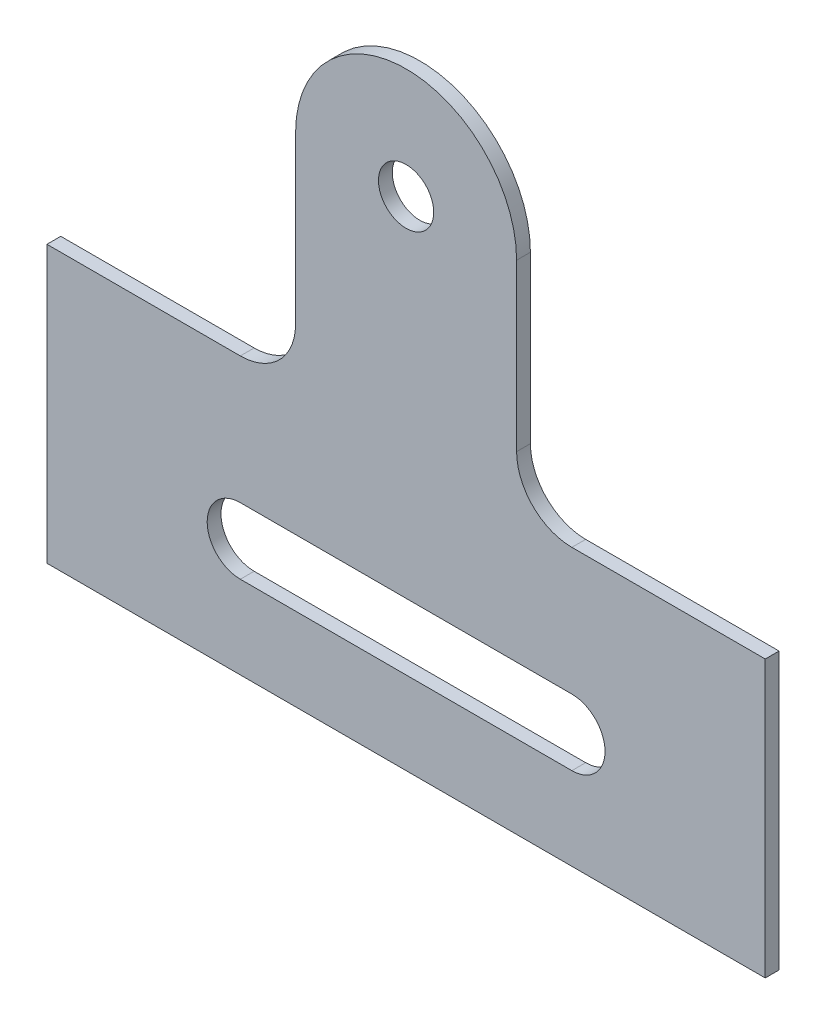
ISO-10303-21;
HEADER;
FILE_DESCRIPTION(('STEP AP214'),'2;1');
FILE_NAME('part.step','',(''),(''),'','','');
FILE_SCHEMA(('AUTOMOTIVE_DESIGN { 1 0 10303 214 1 1 1 1 }'));
ENDSEC;
DATA;
#1=APPLICATION_CONTEXT('core data for automotive mechanical design processes');
#2=APPLICATION_PROTOCOL_DEFINITION('international standard','automotive_design',2000,#1);
#3=PRODUCT_CONTEXT('',#1,'mechanical');
#4=PRODUCT('Part','Part','',(#3));
#5=PRODUCT_RELATED_PRODUCT_CATEGORY('part','',(#4));
#6=PRODUCT_DEFINITION_FORMATION('','',#4);
#7=PRODUCT_DEFINITION_CONTEXT('part definition',#1,'design');
#8=PRODUCT_DEFINITION('design','',#6,#7);
#9=PRODUCT_DEFINITION_SHAPE('','',#8);
#10=(LENGTH_UNIT() NAMED_UNIT(*) SI_UNIT(.MILLI.,.METRE.));
#11=(NAMED_UNIT(*) PLANE_ANGLE_UNIT() SI_UNIT($,.RADIAN.));
#12=(NAMED_UNIT(*) SI_UNIT($,.STERADIAN.) SOLID_ANGLE_UNIT());
#13=UNCERTAINTY_MEASURE_WITH_UNIT(LENGTH_MEASURE(1.E-05),#10,'distance_accuracy_value','');
#14=(GEOMETRIC_REPRESENTATION_CONTEXT(3) GLOBAL_UNCERTAINTY_ASSIGNED_CONTEXT((#13)) GLOBAL_UNIT_ASSIGNED_CONTEXT((#10,
#11,#12)) REPRESENTATION_CONTEXT('',''));
#15=CARTESIAN_POINT('',(0.,0.,0.));
#16=DIRECTION('',(0.,0.,1.));
#17=DIRECTION('',(1.,0.,0.));
#18=AXIS2_PLACEMENT_3D('',#15,#16,#17);
#19=CARTESIAN_POINT('',(0.,90.,2.5));
#20=DIRECTION('',(0.,0.,1.));
#21=DIRECTION('',(1.,0.,0.));
#22=AXIS2_PLACEMENT_3D('',#19,#20,#21);
#23=PLANE('',#22);
#24=DIRECTION('',(1.,0.,0.));
#25=VECTOR('',#24,1.);
#26=CARTESIAN_POINT('',(-30.,15.,2.5));
#27=LINE('',#26,#25);
#28=CARTESIAN_POINT('',(-30.,15.,2.5));
#29=VERTEX_POINT('',#28);
#30=CARTESIAN_POINT('',(30.,15.,2.5));
#31=VERTEX_POINT('',#30);
#32=EDGE_CURVE('E150',#29,#31,#27,.T.);
#33=ORIENTED_EDGE('',*,*,#32,.F.);
#34=CARTESIAN_POINT('',(-30.,21.,2.5));
#35=DIRECTION('',(0.,0.,1.));
#36=DIRECTION('',(1.,0.,0.));
#37=AXIS2_PLACEMENT_3D('',#34,#35,#36);
#38=CIRCLE('',#37,6.);
#39=CARTESIAN_POINT('',(-30.,27.,2.5));
#40=VERTEX_POINT('',#39);
#41=EDGE_CURVE('E141',#40,#29,#38,.T.);
#42=ORIENTED_EDGE('',*,*,#41,.F.);
#43=DIRECTION('',(-1.,0.,0.));
#44=VECTOR('',#43,1.);
#45=CARTESIAN_POINT('',(-30.,27.,2.5));
#46=LINE('',#45,#44);
#47=CARTESIAN_POINT('',(30.,27.,2.5));
#48=VERTEX_POINT('',#47);
#49=EDGE_CURVE('E168',#48,#40,#46,.T.);
#50=ORIENTED_EDGE('',*,*,#49,.F.);
#51=CARTESIAN_POINT('',(30.,21.,2.5));
#52=DIRECTION('',(0.,0.,1.));
#53=DIRECTION('',(1.,0.,0.));
#54=AXIS2_PLACEMENT_3D('',#51,#52,#53);
#55=CIRCLE('',#54,6.);
#56=EDGE_CURVE('E164',#31,#48,#55,.T.);
#57=ORIENTED_EDGE('',*,*,#56,.F.);
#58=EDGE_LOOP('',(#33,#42,#50,#57));
#59=FACE_BOUND('',#58,.T.);
#60=CARTESIAN_POINT('',(0.,90.,2.5));
#61=DIRECTION('',(0.,0.,1.));
#62=DIRECTION('',(1.,0.,0.));
#63=AXIS2_PLACEMENT_3D('',#60,#61,#62);
#64=CIRCLE('',#63,20.);
#65=CARTESIAN_POINT('',(20.,90.,2.5));
#66=VERTEX_POINT('',#65);
#67=CARTESIAN_POINT('',(-20.,90.,2.5));
#68=VERTEX_POINT('',#67);
#69=EDGE_CURVE('E192',#66,#68,#64,.T.);
#70=ORIENTED_EDGE('',*,*,#69,.T.);
#71=DIRECTION('',(0.,-1.,0.));
#72=VECTOR('',#71,1.);
#73=CARTESIAN_POINT('',(-20.,60.,2.5));
#74=LINE('',#73,#72);
#75=CARTESIAN_POINT('',(-20.,60.,2.5));
#76=VERTEX_POINT('',#75);
#77=EDGE_CURVE('E196',#68,#76,#74,.T.);
#78=ORIENTED_EDGE('',*,*,#77,.T.);
#79=CARTESIAN_POINT('',(-30.,60.,2.5));
#80=DIRECTION('',(0.,0.,-1.));
#81=DIRECTION('',(-1.,0.,0.));
#82=AXIS2_PLACEMENT_3D('',#79,#80,#81);
#83=CIRCLE('',#82,9.99999999999999);
#84=CARTESIAN_POINT('',(-30.,50.,2.5));
#85=VERTEX_POINT('',#84);
#86=EDGE_CURVE('E200',#76,#85,#83,.T.);
#87=ORIENTED_EDGE('',*,*,#86,.T.);
#88=DIRECTION('',(-1.,0.,0.));
#89=VECTOR('',#88,1.);
#90=CARTESIAN_POINT('',(-65.,50.,2.5));
#91=LINE('',#90,#89);
#92=CARTESIAN_POINT('',(-65.,50.,2.5));
#93=VERTEX_POINT('',#92);
#94=EDGE_CURVE('E203',#85,#93,#91,.T.);
#95=ORIENTED_EDGE('',*,*,#94,.T.);
#96=DIRECTION('',(0.,-1.,0.));
#97=VECTOR('',#96,1.);
#98=CARTESIAN_POINT('',(-65.,0.,2.5));
#99=LINE('',#98,#97);
#100=CARTESIAN_POINT('',(-65.,0.,2.5));
#101=VERTEX_POINT('',#100);
#102=EDGE_CURVE('E206',#93,#101,#99,.T.);
#103=ORIENTED_EDGE('',*,*,#102,.T.);
#104=DIRECTION('',(1.,0.,0.));
#105=VECTOR('',#104,1.);
#106=CARTESIAN_POINT('',(-65.,0.,2.5));
#107=LINE('',#106,#105);
#108=CARTESIAN_POINT('',(65.,0.,2.5));
#109=VERTEX_POINT('',#108);
#110=EDGE_CURVE('E209',#101,#109,#107,.T.);
#111=ORIENTED_EDGE('',*,*,#110,.T.);
#112=DIRECTION('',(0.,1.,0.));
#113=VECTOR('',#112,1.);
#114=CARTESIAN_POINT('',(65.,0.,2.5));
#115=LINE('',#114,#113);
#116=CARTESIAN_POINT('',(65.,50.,2.5));
#117=VERTEX_POINT('',#116);
#118=EDGE_CURVE('E212',#109,#117,#115,.T.);
#119=ORIENTED_EDGE('',*,*,#118,.T.);
#120=DIRECTION('',(-1.,0.,0.));
#121=VECTOR('',#120,1.);
#122=CARTESIAN_POINT('',(65.,50.,2.5));
#123=LINE('',#122,#121);
#124=CARTESIAN_POINT('',(30.,50.,2.5));
#125=VERTEX_POINT('',#124);
#126=EDGE_CURVE('E215',#117,#125,#123,.T.);
#127=ORIENTED_EDGE('',*,*,#126,.T.);
#128=CARTESIAN_POINT('',(30.,60.,2.5));
#129=DIRECTION('',(0.,0.,-1.));
#130=DIRECTION('',(1.,0.,0.));
#131=AXIS2_PLACEMENT_3D('',#128,#129,#130);
#132=CIRCLE('',#131,9.99999999999999);
#133=CARTESIAN_POINT('',(20.,60.,2.5));
#134=VERTEX_POINT('',#133);
#135=EDGE_CURVE('E218',#125,#134,#132,.T.);
#136=ORIENTED_EDGE('',*,*,#135,.T.);
#137=DIRECTION('',(0.,1.,0.));
#138=VECTOR('',#137,1.);
#139=CARTESIAN_POINT('',(20.,60.,2.5));
#140=LINE('',#139,#138);
#141=EDGE_CURVE('E221',#134,#66,#140,.T.);
#142=ORIENTED_EDGE('',*,*,#141,.T.);
#143=EDGE_LOOP('',(#70,#78,#87,#95,#103,#111,#119,#127,#136,#142));
#144=FACE_BOUND('',#143,.T.);
#145=CARTESIAN_POINT('',(0.,90.,2.5));
#146=DIRECTION('',(0.,0.,1.));
#147=DIRECTION('',(1.,0.,0.));
#148=AXIS2_PLACEMENT_3D('',#145,#146,#147);
#149=CIRCLE('',#148,5.);
#150=CARTESIAN_POINT('',(5.,90.,2.5));
#151=VERTEX_POINT('',#150);
#152=EDGE_CURVE('E176',#151,#151,#149,.T.);
#153=ORIENTED_EDGE('',*,*,#152,.F.);
#154=EDGE_LOOP('',(#153));
#155=FACE_BOUND('',#154,.T.);
#156=ADVANCED_FACE('F39',(#59,#144,#155),#23,.T.);
#157=CARTESIAN_POINT('',(0.,90.,0.));
#158=DIRECTION('',(0.,0.,1.));
#159=DIRECTION('',(1.,0.,0.));
#160=AXIS2_PLACEMENT_3D('',#157,#158,#159);
#161=PLANE('',#160);
#162=CARTESIAN_POINT('',(0.,90.,0.));
#163=DIRECTION('',(0.,0.,1.));
#164=DIRECTION('',(1.,0.,0.));
#165=AXIS2_PLACEMENT_3D('',#162,#163,#164);
#166=CIRCLE('',#165,20.);
#167=CARTESIAN_POINT('',(20.,90.,0.));
#168=VERTEX_POINT('',#167);
#169=CARTESIAN_POINT('',(-20.,90.,0.));
#170=VERTEX_POINT('',#169);
#171=EDGE_CURVE('E159',#168,#170,#166,.T.);
#172=ORIENTED_EDGE('',*,*,#171,.F.);
#173=DIRECTION('',(0.,1.,0.));
#174=VECTOR('',#173,1.);
#175=CARTESIAN_POINT('',(20.,60.,0.));
#176=LINE('',#175,#174);
#177=CARTESIAN_POINT('',(20.,60.,0.));
#178=VERTEX_POINT('',#177);
#179=EDGE_CURVE('E197',#178,#168,#176,.T.);
#180=ORIENTED_EDGE('',*,*,#179,.F.);
#181=CARTESIAN_POINT('',(30.,60.,0.));
#182=DIRECTION('',(0.,0.,-1.));
#183=DIRECTION('',(1.,0.,0.));
#184=AXIS2_PLACEMENT_3D('',#181,#182,#183);
#185=CIRCLE('',#184,9.99999999999999);
#186=CARTESIAN_POINT('',(30.,50.,0.));
#187=VERTEX_POINT('',#186);
#188=EDGE_CURVE('E249',#187,#178,#185,.T.);
#189=ORIENTED_EDGE('',*,*,#188,.F.);
#190=DIRECTION('',(-1.,0.,0.));
#191=VECTOR('',#190,1.);
#192=CARTESIAN_POINT('',(65.,50.,0.));
#193=LINE('',#192,#191);
#194=CARTESIAN_POINT('',(65.,50.,0.));
#195=VERTEX_POINT('',#194);
#196=EDGE_CURVE('E246',#195,#187,#193,.T.);
#197=ORIENTED_EDGE('',*,*,#196,.F.);
#198=DIRECTION('',(0.,1.,0.));
#199=VECTOR('',#198,1.);
#200=CARTESIAN_POINT('',(65.,0.,0.));
#201=LINE('',#200,#199);
#202=CARTESIAN_POINT('',(65.,0.,0.));
#203=VERTEX_POINT('',#202);
#204=EDGE_CURVE('E243',#203,#195,#201,.T.);
#205=ORIENTED_EDGE('',*,*,#204,.F.);
#206=DIRECTION('',(1.,0.,0.));
#207=VECTOR('',#206,1.);
#208=CARTESIAN_POINT('',(-65.,0.,0.));
#209=LINE('',#208,#207);
#210=CARTESIAN_POINT('',(-65.,0.,0.));
#211=VERTEX_POINT('',#210);
#212=EDGE_CURVE('E240',#211,#203,#209,.T.);
#213=ORIENTED_EDGE('',*,*,#212,.F.);
#214=DIRECTION('',(0.,-1.,0.));
#215=VECTOR('',#214,1.);
#216=CARTESIAN_POINT('',(-65.,0.,0.));
#217=LINE('',#216,#215);
#218=CARTESIAN_POINT('',(-65.,50.,0.));
#219=VERTEX_POINT('',#218);
#220=EDGE_CURVE('E237',#219,#211,#217,.T.);
#221=ORIENTED_EDGE('',*,*,#220,.F.);
#222=DIRECTION('',(-1.,0.,0.));
#223=VECTOR('',#222,1.);
#224=CARTESIAN_POINT('',(-65.,50.,0.));
#225=LINE('',#224,#223);
#226=CARTESIAN_POINT('',(-30.,50.,0.));
#227=VERTEX_POINT('',#226);
#228=EDGE_CURVE('E234',#227,#219,#225,.T.);
#229=ORIENTED_EDGE('',*,*,#228,.F.);
#230=CARTESIAN_POINT('',(-30.,60.,0.));
#231=DIRECTION('',(0.,0.,-1.));
#232=DIRECTION('',(-1.,0.,0.));
#233=AXIS2_PLACEMENT_3D('',#230,#231,#232);
#234=CIRCLE('',#233,9.99999999999999);
#235=CARTESIAN_POINT('',(-20.,60.,0.));
#236=VERTEX_POINT('',#235);
#237=EDGE_CURVE('E231',#236,#227,#234,.T.);
#238=ORIENTED_EDGE('',*,*,#237,.F.);
#239=DIRECTION('',(0.,-1.,0.));
#240=VECTOR('',#239,1.);
#241=CARTESIAN_POINT('',(-20.,60.,0.));
#242=LINE('',#241,#240);
#243=EDGE_CURVE('E228',#170,#236,#242,.T.);
#244=ORIENTED_EDGE('',*,*,#243,.F.);
#245=EDGE_LOOP('',(#172,#180,#189,#197,#205,#213,#221,#229,#238,#244));
#246=FACE_BOUND('',#245,.T.);
#247=CARTESIAN_POINT('',(-30.,21.,0.));
#248=DIRECTION('',(0.,0.,1.));
#249=DIRECTION('',(1.,0.,0.));
#250=AXIS2_PLACEMENT_3D('',#247,#248,#249);
#251=CIRCLE('',#250,6.);
#252=CARTESIAN_POINT('',(-30.,27.,0.));
#253=VERTEX_POINT('',#252);
#254=CARTESIAN_POINT('',(-30.,15.,0.));
#255=VERTEX_POINT('',#254);
#256=EDGE_CURVE('E63',#253,#255,#251,.T.);
#257=ORIENTED_EDGE('',*,*,#256,.T.);
#258=DIRECTION('',(1.,0.,0.));
#259=VECTOR('',#258,1.);
#260=CARTESIAN_POINT('',(-30.,15.,0.));
#261=LINE('',#260,#259);
#262=CARTESIAN_POINT('',(30.,15.,0.));
#263=VERTEX_POINT('',#262);
#264=EDGE_CURVE('E157',#255,#263,#261,.T.);
#265=ORIENTED_EDGE('',*,*,#264,.T.);
#266=CARTESIAN_POINT('',(30.,21.,0.));
#267=DIRECTION('',(0.,0.,1.));
#268=DIRECTION('',(1.,0.,0.));
#269=AXIS2_PLACEMENT_3D('',#266,#267,#268);
#270=CIRCLE('',#269,6.);
#271=CARTESIAN_POINT('',(30.,27.,0.));
#272=VERTEX_POINT('',#271);
#273=EDGE_CURVE('E179',#263,#272,#270,.T.);
#274=ORIENTED_EDGE('',*,*,#273,.T.);
#275=DIRECTION('',(-1.,0.,0.));
#276=VECTOR('',#275,1.);
#277=CARTESIAN_POINT('',(-30.,27.,0.));
#278=LINE('',#277,#276);
#279=EDGE_CURVE('E151',#272,#253,#278,.T.);
#280=ORIENTED_EDGE('',*,*,#279,.T.);
#281=EDGE_LOOP('',(#257,#265,#274,#280));
#282=FACE_BOUND('',#281,.T.);
#283=CARTESIAN_POINT('',(0.,90.,0.));
#284=DIRECTION('',(0.,0.,1.));
#285=DIRECTION('',(1.,0.,0.));
#286=AXIS2_PLACEMENT_3D('',#283,#284,#285);
#287=CIRCLE('',#286,5.);
#288=CARTESIAN_POINT('',(5.,90.,0.));
#289=VERTEX_POINT('',#288);
#290=EDGE_CURVE('E481',#289,#289,#287,.T.);
#291=ORIENTED_EDGE('',*,*,#290,.T.);
#292=EDGE_LOOP('',(#291));
#293=FACE_BOUND('',#292,.T.);
#294=ADVANCED_FACE('F296',(#246,#282,#293),#161,.F.);
#295=CARTESIAN_POINT('',(0.,90.,2.5));
#296=DIRECTION('',(0.,0.,-1.));
#297=DIRECTION('',(-1.,0.,0.));
#298=AXIS2_PLACEMENT_3D('',#295,#296,#297);
#299=CYLINDRICAL_SURFACE('',#298,20.);
#300=ORIENTED_EDGE('',*,*,#171,.T.);
#301=DIRECTION('',(0.,0.,-1.));
#302=VECTOR('',#301,1.);
#303=CARTESIAN_POINT('',(-20.,90.,2.5));
#304=LINE('',#303,#302);
#305=EDGE_CURVE('E11',#68,#170,#304,.T.);
#306=ORIENTED_EDGE('',*,*,#305,.F.);
#307=ORIENTED_EDGE('',*,*,#69,.F.);
#308=DIRECTION('',(0.,0.,-1.));
#309=VECTOR('',#308,1.);
#310=CARTESIAN_POINT('',(20.,90.,2.5));
#311=LINE('',#310,#309);
#312=EDGE_CURVE('E224',#66,#168,#311,.T.);
#313=ORIENTED_EDGE('',*,*,#312,.T.);
#314=EDGE_LOOP('',(#300,#306,#307,#313));
#315=FACE_BOUND('',#314,.T.);
#316=ADVANCED_FACE('F41',(#315),#299,.T.);
#317=CARTESIAN_POINT('',(-20.,60.,2.5));
#318=DIRECTION('',(1.,0.,0.));
#319=DIRECTION('',(0.,1.,0.));
#320=AXIS2_PLACEMENT_3D('',#317,#318,#319);
#321=PLANE('',#320);
#322=ORIENTED_EDGE('',*,*,#243,.T.);
#323=DIRECTION('',(0.,0.,-1.));
#324=VECTOR('',#323,1.);
#325=CARTESIAN_POINT('',(-20.,60.,2.5));
#326=LINE('',#325,#324);
#327=EDGE_CURVE('E48',#76,#236,#326,.T.);
#328=ORIENTED_EDGE('',*,*,#327,.F.);
#329=ORIENTED_EDGE('',*,*,#77,.F.);
#330=ORIENTED_EDGE('',*,*,#305,.T.);
#331=EDGE_LOOP('',(#322,#328,#329,#330));
#332=FACE_BOUND('',#331,.T.);
#333=ADVANCED_FACE('F313',(#332),#321,.F.);
#334=CARTESIAN_POINT('',(-30.,60.,2.5));
#335=DIRECTION('',(0.,0.,-1.));
#336=DIRECTION('',(-1.,0.,0.));
#337=AXIS2_PLACEMENT_3D('',#334,#335,#336);
#338=CYLINDRICAL_SURFACE('',#337,9.99999999999999);
#339=ORIENTED_EDGE('',*,*,#237,.T.);
#340=DIRECTION('',(0.,0.,-1.));
#341=VECTOR('',#340,1.);
#342=CARTESIAN_POINT('',(-30.,50.,2.5));
#343=LINE('',#342,#341);
#344=EDGE_CURVE('E281',#85,#227,#343,.T.);
#345=ORIENTED_EDGE('',*,*,#344,.F.);
#346=ORIENTED_EDGE('',*,*,#86,.F.);
#347=ORIENTED_EDGE('',*,*,#327,.T.);
#348=EDGE_LOOP('',(#339,#345,#346,#347));
#349=FACE_BOUND('',#348,.T.);
#350=ADVANCED_FACE('F290',(#349),#338,.F.);
#351=CARTESIAN_POINT('',(-65.,50.,2.5));
#352=DIRECTION('',(0.,-1.,0.));
#353=DIRECTION('',(1.,0.,0.));
#354=AXIS2_PLACEMENT_3D('',#351,#352,#353);
#355=PLANE('',#354);
#356=ORIENTED_EDGE('',*,*,#228,.T.);
#357=DIRECTION('',(0.,0.,-1.));
#358=VECTOR('',#357,1.);
#359=CARTESIAN_POINT('',(-65.,50.,2.5));
#360=LINE('',#359,#358);
#361=EDGE_CURVE('E277',#93,#219,#360,.T.);
#362=ORIENTED_EDGE('',*,*,#361,.F.);
#363=ORIENTED_EDGE('',*,*,#94,.F.);
#364=ORIENTED_EDGE('',*,*,#344,.T.);
#365=EDGE_LOOP('',(#356,#362,#363,#364));
#366=FACE_BOUND('',#365,.T.);
#367=ADVANCED_FACE('F302',(#366),#355,.F.);
#368=CARTESIAN_POINT('',(-65.,0.,2.5));
#369=DIRECTION('',(1.,0.,0.));
#370=DIRECTION('',(0.,0.,-1.));
#371=AXIS2_PLACEMENT_3D('',#368,#369,#370);
#372=PLANE('',#371);
#373=ORIENTED_EDGE('',*,*,#220,.T.);
#374=DIRECTION('',(0.,0.,-1.));
#375=VECTOR('',#374,1.);
#376=CARTESIAN_POINT('',(-65.,0.,2.5));
#377=LINE('',#376,#375);
#378=EDGE_CURVE('E273',#101,#211,#377,.T.);
#379=ORIENTED_EDGE('',*,*,#378,.F.);
#380=ORIENTED_EDGE('',*,*,#102,.F.);
#381=ORIENTED_EDGE('',*,*,#361,.T.);
#382=EDGE_LOOP('',(#373,#379,#380,#381));
#383=FACE_BOUND('',#382,.T.);
#384=ADVANCED_FACE('F306',(#383),#372,.F.);
#385=CARTESIAN_POINT('',(-65.,0.,2.5));
#386=DIRECTION('',(0.,1.,0.));
#387=DIRECTION('',(0.,0.,1.));
#388=AXIS2_PLACEMENT_3D('',#385,#386,#387);
#389=PLANE('',#388);
#390=ORIENTED_EDGE('',*,*,#212,.T.);
#391=DIRECTION('',(0.,0.,-1.));
#392=VECTOR('',#391,1.);
#393=CARTESIAN_POINT('',(65.,0.,2.5));
#394=LINE('',#393,#392);
#395=EDGE_CURVE('E269',#109,#203,#394,.T.);
#396=ORIENTED_EDGE('',*,*,#395,.F.);
#397=ORIENTED_EDGE('',*,*,#110,.F.);
#398=ORIENTED_EDGE('',*,*,#378,.T.);
#399=EDGE_LOOP('',(#390,#396,#397,#398));
#400=FACE_BOUND('',#399,.T.);
#401=ADVANCED_FACE('F336',(#400),#389,.F.);
#402=CARTESIAN_POINT('',(65.,0.,2.5));
#403=DIRECTION('',(-1.,0.,0.));
#404=DIRECTION('',(0.,0.,1.));
#405=AXIS2_PLACEMENT_3D('',#402,#403,#404);
#406=PLANE('',#405);
#407=ORIENTED_EDGE('',*,*,#204,.T.);
#408=DIRECTION('',(0.,0.,-1.));
#409=VECTOR('',#408,1.);
#410=CARTESIAN_POINT('',(65.,50.,2.5));
#411=LINE('',#410,#409);
#412=EDGE_CURVE('E265',#117,#195,#411,.T.);
#413=ORIENTED_EDGE('',*,*,#412,.F.);
#414=ORIENTED_EDGE('',*,*,#118,.F.);
#415=ORIENTED_EDGE('',*,*,#395,.T.);
#416=EDGE_LOOP('',(#407,#413,#414,#415));
#417=FACE_BOUND('',#416,.T.);
#418=ADVANCED_FACE('F333',(#417),#406,.F.);
#419=CARTESIAN_POINT('',(65.,50.,2.5));
#420=DIRECTION('',(0.,-1.,0.));
#421=DIRECTION('',(1.,0.,0.));
#422=AXIS2_PLACEMENT_3D('',#419,#420,#421);
#423=PLANE('',#422);
#424=ORIENTED_EDGE('',*,*,#196,.T.);
#425=DIRECTION('',(0.,0.,-1.));
#426=VECTOR('',#425,1.);
#427=CARTESIAN_POINT('',(30.,50.,2.5));
#428=LINE('',#427,#426);
#429=EDGE_CURVE('E261',#125,#187,#428,.T.);
#430=ORIENTED_EDGE('',*,*,#429,.F.);
#431=ORIENTED_EDGE('',*,*,#126,.F.);
#432=ORIENTED_EDGE('',*,*,#412,.T.);
#433=EDGE_LOOP('',(#424,#430,#431,#432));
#434=FACE_BOUND('',#433,.T.);
#435=ADVANCED_FACE('F329',(#434),#423,.F.);
#436=CARTESIAN_POINT('',(30.,60.,2.5));
#437=DIRECTION('',(0.,0.,-1.));
#438=DIRECTION('',(-1.,0.,0.));
#439=AXIS2_PLACEMENT_3D('',#436,#437,#438);
#440=CYLINDRICAL_SURFACE('',#439,9.99999999999999);
#441=ORIENTED_EDGE('',*,*,#188,.T.);
#442=DIRECTION('',(0.,0.,-1.));
#443=VECTOR('',#442,1.);
#444=CARTESIAN_POINT('',(20.,60.,2.5));
#445=LINE('',#444,#443);
#446=EDGE_CURVE('E257',#134,#178,#445,.T.);
#447=ORIENTED_EDGE('',*,*,#446,.F.);
#448=ORIENTED_EDGE('',*,*,#135,.F.);
#449=ORIENTED_EDGE('',*,*,#429,.T.);
#450=EDGE_LOOP('',(#441,#447,#448,#449));
#451=FACE_BOUND('',#450,.T.);
#452=ADVANCED_FACE('F325',(#451),#440,.F.);
#453=CARTESIAN_POINT('',(20.,60.,2.5));
#454=DIRECTION('',(-1.,0.,0.));
#455=DIRECTION('',(0.,-1.,0.));
#456=AXIS2_PLACEMENT_3D('',#453,#454,#455);
#457=PLANE('',#456);
#458=ORIENTED_EDGE('',*,*,#179,.T.);
#459=ORIENTED_EDGE('',*,*,#312,.F.);
#460=ORIENTED_EDGE('',*,*,#141,.F.);
#461=ORIENTED_EDGE('',*,*,#446,.T.);
#462=EDGE_LOOP('',(#458,#459,#460,#461));
#463=FACE_BOUND('',#462,.T.);
#464=ADVANCED_FACE('F320',(#463),#457,.F.);
#465=CARTESIAN_POINT('',(-30.,21.,2.5));
#466=DIRECTION('',(0.,0.,-1.));
#467=DIRECTION('',(-1.,0.,0.));
#468=AXIS2_PLACEMENT_3D('',#465,#466,#467);
#469=CYLINDRICAL_SURFACE('',#468,6.);
#470=ORIENTED_EDGE('',*,*,#256,.F.);
#471=DIRECTION('',(0.,0.,-1.));
#472=VECTOR('',#471,1.);
#473=CARTESIAN_POINT('',(-30.,27.,2.5));
#474=LINE('',#473,#472);
#475=EDGE_CURVE('E145',#40,#253,#474,.T.);
#476=ORIENTED_EDGE('',*,*,#475,.F.);
#477=ORIENTED_EDGE('',*,*,#41,.T.);
#478=DIRECTION('',(0.,0.,-1.));
#479=VECTOR('',#478,1.);
#480=CARTESIAN_POINT('',(-30.,15.,2.5));
#481=LINE('',#480,#479);
#482=EDGE_CURVE('E144',#29,#255,#481,.T.);
#483=ORIENTED_EDGE('',*,*,#482,.T.);
#484=EDGE_LOOP('',(#470,#476,#477,#483));
#485=FACE_BOUND('',#484,.T.);
#486=ADVANCED_FACE('F143',(#485),#469,.F.);
#487=CARTESIAN_POINT('',(-30.,15.,2.5));
#488=DIRECTION('',(0.,1.,0.));
#489=DIRECTION('',(0.,0.,1.));
#490=AXIS2_PLACEMENT_3D('',#487,#488,#489);
#491=PLANE('',#490);
#492=ORIENTED_EDGE('',*,*,#264,.F.);
#493=ORIENTED_EDGE('',*,*,#482,.F.);
#494=ORIENTED_EDGE('',*,*,#32,.T.);
#495=DIRECTION('',(0.,0.,-1.));
#496=VECTOR('',#495,1.);
#497=CARTESIAN_POINT('',(30.,15.,2.5));
#498=LINE('',#497,#496);
#499=EDGE_CURVE('E160',#31,#263,#498,.T.);
#500=ORIENTED_EDGE('',*,*,#499,.T.);
#501=EDGE_LOOP('',(#492,#493,#494,#500));
#502=FACE_BOUND('',#501,.T.);
#503=ADVANCED_FACE('F154',(#502),#491,.T.);
#504=CARTESIAN_POINT('',(30.,21.,2.5));
#505=DIRECTION('',(0.,0.,-1.));
#506=DIRECTION('',(-1.,0.,0.));
#507=AXIS2_PLACEMENT_3D('',#504,#505,#506);
#508=CYLINDRICAL_SURFACE('',#507,6.);
#509=ORIENTED_EDGE('',*,*,#273,.F.);
#510=ORIENTED_EDGE('',*,*,#499,.F.);
#511=ORIENTED_EDGE('',*,*,#56,.T.);
#512=DIRECTION('',(0.,0.,-1.));
#513=VECTOR('',#512,1.);
#514=CARTESIAN_POINT('',(30.,27.,2.5));
#515=LINE('',#514,#513);
#516=EDGE_CURVE('E55',#48,#272,#515,.T.);
#517=ORIENTED_EDGE('',*,*,#516,.T.);
#518=EDGE_LOOP('',(#509,#510,#511,#517));
#519=FACE_BOUND('',#518,.T.);
#520=ADVANCED_FACE('F382',(#519),#508,.F.);
#521=CARTESIAN_POINT('',(-30.,27.,2.5));
#522=DIRECTION('',(0.,-1.,0.));
#523=DIRECTION('',(0.,0.,-1.));
#524=AXIS2_PLACEMENT_3D('',#521,#522,#523);
#525=PLANE('',#524);
#526=ORIENTED_EDGE('',*,*,#279,.F.);
#527=ORIENTED_EDGE('',*,*,#516,.F.);
#528=ORIENTED_EDGE('',*,*,#49,.T.);
#529=ORIENTED_EDGE('',*,*,#475,.T.);
#530=EDGE_LOOP('',(#526,#527,#528,#529));
#531=FACE_BOUND('',#530,.T.);
#532=ADVANCED_FACE('F388',(#531),#525,.T.);
#533=CARTESIAN_POINT('',(0.,90.,2.5));
#534=DIRECTION('',(0.,0.,-1.));
#535=DIRECTION('',(-1.,0.,0.));
#536=AXIS2_PLACEMENT_3D('',#533,#534,#535);
#537=CYLINDRICAL_SURFACE('',#536,5.);
#538=ORIENTED_EDGE('',*,*,#152,.T.);
#539=EDGE_LOOP('',(#538));
#540=FACE_BOUND('',#539,.T.);
#541=ORIENTED_EDGE('',*,*,#290,.F.);
#542=EDGE_LOOP('',(#541));
#543=FACE_BOUND('',#542,.T.);
#544=ADVANCED_FACE('F396',(#540,#543),#537,.F.);
#545=CLOSED_SHELL('',(#156,#294,#316,#333,#350,#367,#384,#401,#418,#435,#452,#464,#486,#503,
#520,#532,#544));
#546=MANIFOLD_SOLID_BREP('B2',#545);
#547=ADVANCED_BREP_SHAPE_REPRESENTATION('',(#18,#546),#14);
#548=SHAPE_DEFINITION_REPRESENTATION(#9,#547);
ENDSEC;
END-ISO-10303-21;
